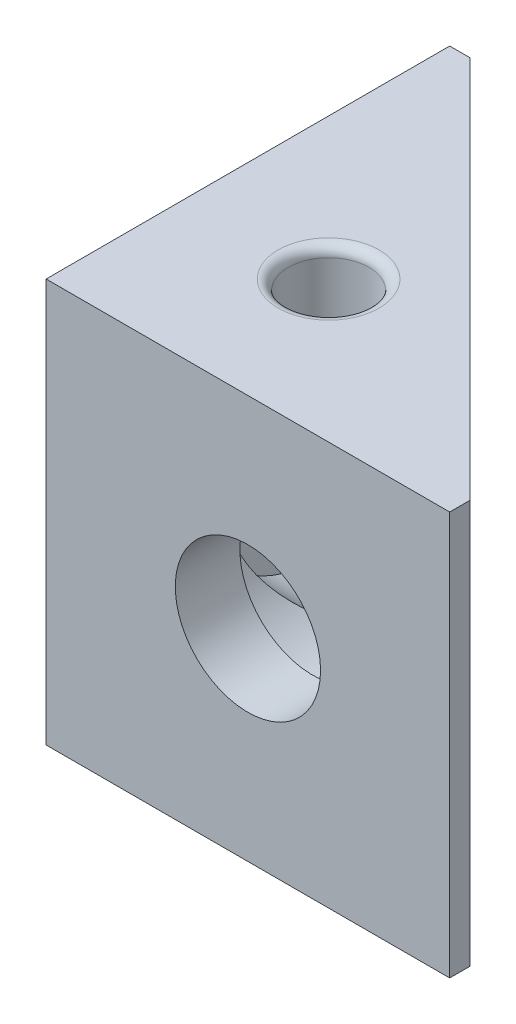
ISO-10303-21;
HEADER;
FILE_DESCRIPTION(('STEP AP214'),'2;1');
FILE_NAME('part.step','',(''),(''),'','','');
FILE_SCHEMA(('AUTOMOTIVE_DESIGN { 1 0 10303 214 1 1 1 1 }'));
ENDSEC;
DATA;
#1=APPLICATION_CONTEXT('core data for automotive mechanical design processes');
#2=APPLICATION_PROTOCOL_DEFINITION('international standard','automotive_design',2000,#1);
#3=PRODUCT_CONTEXT('',#1,'mechanical');
#4=PRODUCT('Part','Part','',(#3));
#5=PRODUCT_RELATED_PRODUCT_CATEGORY('part','',(#4));
#6=PRODUCT_DEFINITION_FORMATION('','',#4);
#7=PRODUCT_DEFINITION_CONTEXT('part definition',#1,'design');
#8=PRODUCT_DEFINITION('design','',#6,#7);
#9=PRODUCT_DEFINITION_SHAPE('','',#8);
#10=(LENGTH_UNIT() NAMED_UNIT(*) SI_UNIT(.MILLI.,.METRE.));
#11=(NAMED_UNIT(*) PLANE_ANGLE_UNIT() SI_UNIT($,.RADIAN.));
#12=(NAMED_UNIT(*) SI_UNIT($,.STERADIAN.) SOLID_ANGLE_UNIT());
#13=UNCERTAINTY_MEASURE_WITH_UNIT(LENGTH_MEASURE(1.E-05),#10,'distance_accuracy_value','');
#14=(GEOMETRIC_REPRESENTATION_CONTEXT(3) GLOBAL_UNCERTAINTY_ASSIGNED_CONTEXT((#13)) GLOBAL_UNIT_ASSIGNED_CONTEXT((#10,
#11,#12)) REPRESENTATION_CONTEXT('',''));
#15=CARTESIAN_POINT('',(0.,0.,0.));
#16=DIRECTION('',(0.,0.,1.));
#17=DIRECTION('',(1.,0.,0.));
#18=AXIS2_PLACEMENT_3D('',#15,#16,#17);
#19=CARTESIAN_POINT('',(10.,0.,-29.778174593052));
#20=DIRECTION('',(0.,0.,1.));
#21=DIRECTION('',(1.,0.,0.));
#22=AXIS2_PLACEMENT_3D('',#19,#20,#21);
#23=CYLINDRICAL_SURFACE('',#22,5.5);
#24=CARTESIAN_POINT('',(10.,0.,-3.2));
#25=DIRECTION('',(0.,0.,1.));
#26=DIRECTION('',(1.,0.,0.));
#27=AXIS2_PLACEMENT_3D('',#24,#25,#26);
#28=CIRCLE('',#27,5.5);
#29=CARTESIAN_POINT('',(15.5,0.,-3.2));
#30=VERTEX_POINT('',#29);
#31=EDGE_CURVE('E227',#30,#30,#28,.T.);
#32=ORIENTED_EDGE('',*,*,#31,.T.);
#33=EDGE_LOOP('',(#32));
#34=FACE_BOUND('',#33,.T.);
#35=CARTESIAN_POINT('',(10.,0.,-10.));
#36=DIRECTION('',(0.707106781186547,0.,0.707106781186547));
#37=DIRECTION('',(-0.707106781186547,0.,0.707106781186547));
#38=AXIS2_PLACEMENT_3D('',#35,#36,#37);
#39=ELLIPSE('',#38,7.77817459305202,5.5);
#40=CARTESIAN_POINT('',(10.,-5.5,-10.));
#41=VERTEX_POINT('',#40);
#42=CARTESIAN_POINT('',(10.,5.5,-10.));
#43=VERTEX_POINT('',#42);
#44=EDGE_CURVE('E54',#41,#43,#39,.F.);
#45=ORIENTED_EDGE('',*,*,#44,.T.);
#46=CARTESIAN_POINT('',(10.,0.,-10.));
#47=DIRECTION('',(-0.707106781186547,0.,0.707106781186547));
#48=DIRECTION('',(0.707106781186547,0.,0.707106781186547));
#49=AXIS2_PLACEMENT_3D('',#46,#47,#48);
#50=ELLIPSE('',#49,7.77817459305202,5.5);
#51=EDGE_CURVE('E151',#43,#41,#50,.F.);
#52=ORIENTED_EDGE('',*,*,#51,.T.);
#53=EDGE_LOOP('',(#45,#52));
#54=FACE_BOUND('',#53,.T.);
#55=ADVANCED_FACE('F40',(#34,#54),#23,.F.);
#56=CARTESIAN_POINT('',(20.,10.,0.));
#57=DIRECTION('',(0.,0.,-1.));
#58=DIRECTION('',(-1.,0.,0.));
#59=AXIS2_PLACEMENT_3D('',#56,#57,#58);
#60=PLANE('',#59);
#61=CARTESIAN_POINT('',(10.,0.,0.));
#62=DIRECTION('',(0.,0.,1.));
#63=DIRECTION('',(1.,0.,0.));
#64=AXIS2_PLACEMENT_3D('',#61,#62,#63);
#65=CIRCLE('',#64,3.6);
#66=CARTESIAN_POINT('',(13.6,0.,0.));
#67=VERTEX_POINT('',#66);
#68=EDGE_CURVE('E131',#67,#67,#65,.T.);
#69=ORIENTED_EDGE('',*,*,#68,.F.);
#70=EDGE_LOOP('',(#69));
#71=FACE_BOUND('',#70,.T.);
#72=DIRECTION('',(1.,0.,0.));
#73=VECTOR('',#72,1.);
#74=CARTESIAN_POINT('',(20.,-10.,0.));
#75=LINE('',#74,#73);
#76=CARTESIAN_POINT('',(0.,-10.,0.));
#77=VERTEX_POINT('',#76);
#78=CARTESIAN_POINT('',(20.,-10.,0.));
#79=VERTEX_POINT('',#78);
#80=EDGE_CURVE('E127',#77,#79,#75,.T.);
#81=ORIENTED_EDGE('',*,*,#80,.T.);
#82=DIRECTION('',(0.,-1.,0.));
#83=VECTOR('',#82,1.);
#84=CARTESIAN_POINT('',(20.,10.,0.));
#85=LINE('',#84,#83);
#86=CARTESIAN_POINT('',(20.,10.,0.));
#87=VERTEX_POINT('',#86);
#88=EDGE_CURVE('E141',#87,#79,#85,.T.);
#89=ORIENTED_EDGE('',*,*,#88,.F.);
#90=DIRECTION('',(1.,0.,0.));
#91=VECTOR('',#90,1.);
#92=CARTESIAN_POINT('',(20.,10.,0.));
#93=LINE('',#92,#91);
#94=CARTESIAN_POINT('',(0.,10.,0.));
#95=VERTEX_POINT('',#94);
#96=EDGE_CURVE('E137',#95,#87,#93,.T.);
#97=ORIENTED_EDGE('',*,*,#96,.F.);
#98=DIRECTION('',(0.,-1.,0.));
#99=VECTOR('',#98,1.);
#100=CARTESIAN_POINT('',(0.,10.,0.));
#101=LINE('',#100,#99);
#102=EDGE_CURVE('E123',#95,#77,#101,.T.);
#103=ORIENTED_EDGE('',*,*,#102,.T.);
#104=EDGE_LOOP('',(#81,#89,#97,#103));
#105=FACE_BOUND('',#104,.T.);
#106=ADVANCED_FACE('F169',(#71,#105),#60,.F.);
#107=CARTESIAN_POINT('',(20.,10.,0.));
#108=DIRECTION('',(-1.,0.,0.));
#109=DIRECTION('',(0.,0.,1.));
#110=AXIS2_PLACEMENT_3D('',#107,#108,#109);
#111=PLANE('',#110);
#112=DIRECTION('',(0.,0.,-1.));
#113=VECTOR('',#112,1.);
#114=CARTESIAN_POINT('',(20.,-10.,0.));
#115=LINE('',#114,#113);
#116=CARTESIAN_POINT('',(20.,-10.,-1.));
#117=VERTEX_POINT('',#116);
#118=EDGE_CURVE('E130',#79,#117,#115,.T.);
#119=ORIENTED_EDGE('',*,*,#118,.T.);
#120=DIRECTION('',(0.,-1.,0.));
#121=VECTOR('',#120,1.);
#122=CARTESIAN_POINT('',(20.,10.,-1.));
#123=LINE('',#122,#121);
#124=CARTESIAN_POINT('',(20.,10.,-1.));
#125=VERTEX_POINT('',#124);
#126=EDGE_CURVE('E118',#125,#117,#123,.T.);
#127=ORIENTED_EDGE('',*,*,#126,.F.);
#128=DIRECTION('',(0.,0.,-1.));
#129=VECTOR('',#128,1.);
#130=CARTESIAN_POINT('',(20.,10.,0.));
#131=LINE('',#130,#129);
#132=EDGE_CURVE('E96',#87,#125,#131,.T.);
#133=ORIENTED_EDGE('',*,*,#132,.F.);
#134=ORIENTED_EDGE('',*,*,#88,.T.);
#135=EDGE_LOOP('',(#119,#127,#133,#134));
#136=FACE_BOUND('',#135,.T.);
#137=ADVANCED_FACE('F178',(#136),#111,.F.);
#138=CARTESIAN_POINT('',(1.,10.,-20.));
#139=DIRECTION('',(-0.707106781186548,0.,0.707106781186548));
#140=DIRECTION('',(0.707106781186548,0.,0.707106781186548));
#141=AXIS2_PLACEMENT_3D('',#138,#139,#140);
#142=PLANE('',#141);
#143=CARTESIAN_POINT('',(10.,0.,-11.));
#144=DIRECTION('',(-0.707106781186548,0.,0.707106781186548));
#145=DIRECTION('',(0.707106781186548,0.,0.707106781186548));
#146=AXIS2_PLACEMENT_3D('',#143,#144,#145);
#147=ELLIPSE('',#146,7.77817459305202,5.5);
#148=CARTESIAN_POINT('',(10.5000000000004,-5.47722557505166,-10.4999999999996));
#149=VERTEX_POINT('',#148);
#150=CARTESIAN_POINT('',(10.5000000000004,5.47722557505166,-10.4999999999996));
#151=VERTEX_POINT('',#150);
#152=EDGE_CURVE('E201',#149,#151,#147,.F.);
#153=ORIENTED_EDGE('',*,*,#152,.F.);
#154=CARTESIAN_POINT('',(11.,0.,-10.));
#155=DIRECTION('',(-0.707106781186548,0.,0.707106781186548));
#156=DIRECTION('',(-0.707106781186548,0.,-0.707106781186548));
#157=AXIS2_PLACEMENT_3D('',#154,#155,#156);
#158=ELLIPSE('',#157,7.77817459305202,5.5);
#159=EDGE_CURVE('E209',#151,#149,#158,.F.);
#160=ORIENTED_EDGE('',*,*,#159,.F.);
#161=EDGE_LOOP('',(#153,#160));
#162=FACE_BOUND('',#161,.T.);
#163=DIRECTION('',(-0.707106781186548,0.,-0.707106781186548));
#164=VECTOR('',#163,1.);
#165=CARTESIAN_POINT('',(1.,-10.,-20.));
#166=LINE('',#165,#164);
#167=CARTESIAN_POINT('',(1.,-10.,-20.));
#168=VERTEX_POINT('',#167);
#169=EDGE_CURVE('E115',#117,#168,#166,.T.);
#170=ORIENTED_EDGE('',*,*,#169,.T.);
#171=DIRECTION('',(0.,-1.,0.));
#172=VECTOR('',#171,1.);
#173=CARTESIAN_POINT('',(1.,10.,-20.));
#174=LINE('',#173,#172);
#175=CARTESIAN_POINT('',(1.,10.,-20.));
#176=VERTEX_POINT('',#175);
#177=EDGE_CURVE('E112',#176,#168,#174,.T.);
#178=ORIENTED_EDGE('',*,*,#177,.F.);
#179=DIRECTION('',(-0.707106781186548,0.,-0.707106781186548));
#180=VECTOR('',#179,1.);
#181=CARTESIAN_POINT('',(1.,10.,-20.));
#182=LINE('',#181,#180);
#183=EDGE_CURVE('E102',#125,#176,#182,.T.);
#184=ORIENTED_EDGE('',*,*,#183,.F.);
#185=ORIENTED_EDGE('',*,*,#126,.T.);
#186=EDGE_LOOP('',(#170,#178,#184,#185));
#187=FACE_BOUND('',#186,.T.);
#188=ADVANCED_FACE('F113',(#162,#187),#142,.F.);
#189=CARTESIAN_POINT('',(0.,10.,-20.));
#190=DIRECTION('',(0.,0.,1.));
#191=DIRECTION('',(1.,0.,0.));
#192=AXIS2_PLACEMENT_3D('',#189,#190,#191);
#193=PLANE('',#192);
#194=DIRECTION('',(-1.,0.,0.));
#195=VECTOR('',#194,1.);
#196=CARTESIAN_POINT('',(0.,-10.,-20.));
#197=LINE('',#196,#195);
#198=CARTESIAN_POINT('',(0.,-10.,-20.));
#199=VERTEX_POINT('',#198);
#200=EDGE_CURVE('E134',#168,#199,#197,.T.);
#201=ORIENTED_EDGE('',*,*,#200,.T.);
#202=DIRECTION('',(0.,-1.,0.));
#203=VECTOR('',#202,1.);
#204=CARTESIAN_POINT('',(0.,10.,-20.));
#205=LINE('',#204,#203);
#206=CARTESIAN_POINT('',(0.,10.,-20.));
#207=VERTEX_POINT('',#206);
#208=EDGE_CURVE('E119',#207,#199,#205,.T.);
#209=ORIENTED_EDGE('',*,*,#208,.F.);
#210=DIRECTION('',(-1.,0.,0.));
#211=VECTOR('',#210,1.);
#212=CARTESIAN_POINT('',(0.,10.,-20.));
#213=LINE('',#212,#211);
#214=EDGE_CURVE('E106',#176,#207,#213,.T.);
#215=ORIENTED_EDGE('',*,*,#214,.F.);
#216=ORIENTED_EDGE('',*,*,#177,.T.);
#217=EDGE_LOOP('',(#201,#209,#215,#216));
#218=FACE_BOUND('',#217,.T.);
#219=ADVANCED_FACE('F121',(#218),#193,.F.);
#220=CARTESIAN_POINT('',(0.,10.,0.));
#221=DIRECTION('',(1.,0.,0.));
#222=DIRECTION('',(0.,0.,-1.));
#223=AXIS2_PLACEMENT_3D('',#220,#221,#222);
#224=PLANE('',#223);
#225=CARTESIAN_POINT('',(0.,0.,-10.));
#226=DIRECTION('',(-1.,0.,0.));
#227=DIRECTION('',(0.,0.,1.));
#228=AXIS2_PLACEMENT_3D('',#225,#226,#227);
#229=CIRCLE('',#228,3.6);
#230=CARTESIAN_POINT('',(0.,0.,-6.4));
#231=VERTEX_POINT('',#230);
#232=EDGE_CURVE('E212',#231,#231,#229,.T.);
#233=ORIENTED_EDGE('',*,*,#232,.F.);
#234=EDGE_LOOP('',(#233));
#235=FACE_BOUND('',#234,.T.);
#236=DIRECTION('',(0.,0.,1.));
#237=VECTOR('',#236,1.);
#238=CARTESIAN_POINT('',(0.,-10.,0.));
#239=LINE('',#238,#237);
#240=EDGE_CURVE('E87',#199,#77,#239,.T.);
#241=ORIENTED_EDGE('',*,*,#240,.T.);
#242=ORIENTED_EDGE('',*,*,#102,.F.);
#243=DIRECTION('',(0.,0.,1.));
#244=VECTOR('',#243,1.);
#245=CARTESIAN_POINT('',(0.,10.,0.));
#246=LINE('',#245,#244);
#247=EDGE_CURVE('E63',#207,#95,#246,.T.);
#248=ORIENTED_EDGE('',*,*,#247,.F.);
#249=ORIENTED_EDGE('',*,*,#208,.T.);
#250=EDGE_LOOP('',(#241,#242,#248,#249));
#251=FACE_BOUND('',#250,.T.);
#252=ADVANCED_FACE('F238',(#235,#251),#224,.F.);
#253=CARTESIAN_POINT('',(0.,10.,0.));
#254=DIRECTION('',(0.,-1.,0.));
#255=DIRECTION('',(0.,0.,-1.));
#256=AXIS2_PLACEMENT_3D('',#253,#254,#255);
#257=PLANE('',#256);
#258=CARTESIAN_POINT('',(7.,10.,-7.));
#259=DIRECTION('',(0.,-1.,0.));
#260=DIRECTION('',(0.,0.,-1.));
#261=AXIS2_PLACEMENT_3D('',#258,#259,#260);
#262=CIRCLE('',#261,2.5);
#263=CARTESIAN_POINT('',(7.,10.,-9.5));
#264=VERTEX_POINT('',#263);
#265=EDGE_CURVE('E11',#264,#264,#262,.T.);
#266=ORIENTED_EDGE('',*,*,#265,.T.);
#267=EDGE_LOOP('',(#266));
#268=FACE_BOUND('',#267,.T.);
#269=ORIENTED_EDGE('',*,*,#96,.T.);
#270=ORIENTED_EDGE('',*,*,#132,.T.);
#271=ORIENTED_EDGE('',*,*,#183,.T.);
#272=ORIENTED_EDGE('',*,*,#214,.T.);
#273=ORIENTED_EDGE('',*,*,#247,.T.);
#274=EDGE_LOOP('',(#269,#270,#271,#272,#273));
#275=FACE_BOUND('',#274,.T.);
#276=ADVANCED_FACE('F104',(#268,#275),#257,.F.);
#277=CARTESIAN_POINT('',(0.,-10.,0.));
#278=DIRECTION('',(0.,-1.,0.));
#279=DIRECTION('',(0.,0.,-1.));
#280=AXIS2_PLACEMENT_3D('',#277,#278,#279);
#281=PLANE('',#280);
#282=ORIENTED_EDGE('',*,*,#80,.F.);
#283=ORIENTED_EDGE('',*,*,#240,.F.);
#284=ORIENTED_EDGE('',*,*,#200,.F.);
#285=ORIENTED_EDGE('',*,*,#169,.F.);
#286=ORIENTED_EDGE('',*,*,#118,.F.);
#287=EDGE_LOOP('',(#282,#283,#284,#285,#286));
#288=FACE_BOUND('',#287,.T.);
#289=ADVANCED_FACE('F194',(#288),#281,.T.);
#290=CARTESIAN_POINT('',(10.,0.,-23.2911688245431));
#291=DIRECTION('',(0.,0.,1.));
#292=DIRECTION('',(1.,0.,0.));
#293=AXIS2_PLACEMENT_3D('',#290,#291,#292);
#294=CYLINDRICAL_SURFACE('',#293,3.6);
#295=CARTESIAN_POINT('',(10.,0.,-3.2));
#296=DIRECTION('',(0.,0.,1.));
#297=DIRECTION('',(1.,0.,0.));
#298=AXIS2_PLACEMENT_3D('',#295,#296,#297);
#299=CIRCLE('',#298,3.6);
#300=CARTESIAN_POINT('',(13.6,0.,-3.2));
#301=VERTEX_POINT('',#300);
#302=EDGE_CURVE('E216',#301,#301,#299,.T.);
#303=ORIENTED_EDGE('',*,*,#302,.F.);
#304=EDGE_LOOP('',(#303));
#305=FACE_BOUND('',#304,.T.);
#306=ORIENTED_EDGE('',*,*,#68,.T.);
#307=EDGE_LOOP('',(#306));
#308=FACE_BOUND('',#307,.T.);
#309=ADVANCED_FACE('F185',(#305,#308),#294,.F.);
#310=CARTESIAN_POINT('',(10.,0.,-10.));
#311=DIRECTION('',(0.707106781186547,0.,0.707106781186547));
#312=DIRECTION('',(-0.707106781186547,0.,0.707106781186547));
#313=AXIS2_PLACEMENT_3D('',#310,#311,#312);
#314=ELLIPSE('',#313,7.77817459305202,5.5);
#315=EDGE_CURVE('E144',#151,#43,#314,.T.);
#316=ORIENTED_EDGE('',*,*,#315,.T.);
#317=CARTESIAN_POINT('',(10.,0.,-10.));
#318=DIRECTION('',(-0.707106781186547,0.,0.707106781186547));
#319=DIRECTION('',(0.707106781186547,0.,0.707106781186547));
#320=AXIS2_PLACEMENT_3D('',#317,#318,#319);
#321=ELLIPSE('',#320,7.77817459305202,5.5);
#322=EDGE_CURVE('E148',#43,#41,#321,.T.);
#323=ORIENTED_EDGE('',*,*,#322,.T.);
#324=EDGE_CURVE('E147',#41,#149,#314,.T.);
#325=ORIENTED_EDGE('',*,*,#324,.T.);
#326=ORIENTED_EDGE('',*,*,#152,.T.);
#327=EDGE_LOOP('',(#316,#323,#325,#326));
#328=FACE_BOUND('',#327,.T.);
#329=ADVANCED_FACE('F172',(#328),#23,.F.);
#330=CARTESIAN_POINT('',(10.,0.,-3.2));
#331=DIRECTION('',(0.,0.,1.));
#332=DIRECTION('',(1.,0.,0.));
#333=AXIS2_PLACEMENT_3D('',#330,#331,#332);
#334=PLANE('',#333);
#335=ORIENTED_EDGE('',*,*,#302,.T.);
#336=EDGE_LOOP('',(#335));
#337=FACE_BOUND('',#336,.T.);
#338=ORIENTED_EDGE('',*,*,#31,.F.);
#339=EDGE_LOOP('',(#338));
#340=FACE_BOUND('',#339,.T.);
#341=ADVANCED_FACE('F184',(#337,#340),#334,.F.);
#342=CARTESIAN_POINT('',(23.2911688245431,0.,-10.));
#343=DIRECTION('',(-1.,0.,0.));
#344=DIRECTION('',(0.,0.,1.));
#345=AXIS2_PLACEMENT_3D('',#342,#343,#344);
#346=CYLINDRICAL_SURFACE('',#345,3.6);
#347=CARTESIAN_POINT('',(3.2,0.,-10.));
#348=DIRECTION('',(-1.,0.,0.));
#349=DIRECTION('',(0.,0.,1.));
#350=AXIS2_PLACEMENT_3D('',#347,#348,#349);
#351=CIRCLE('',#350,3.6);
#352=CARTESIAN_POINT('',(3.2,0.,-6.4));
#353=VERTEX_POINT('',#352);
#354=EDGE_CURVE('E219',#353,#353,#351,.T.);
#355=ORIENTED_EDGE('',*,*,#354,.F.);
#356=EDGE_LOOP('',(#355));
#357=FACE_BOUND('',#356,.T.);
#358=ORIENTED_EDGE('',*,*,#232,.T.);
#359=EDGE_LOOP('',(#358));
#360=FACE_BOUND('',#359,.T.);
#361=ADVANCED_FACE('F191',(#357,#360),#346,.F.);
#362=CARTESIAN_POINT('',(3.2,0.,-10.));
#363=DIRECTION('',(-1.,0.,0.));
#364=DIRECTION('',(0.,0.,1.));
#365=AXIS2_PLACEMENT_3D('',#362,#363,#364);
#366=PLANE('',#365);
#367=ORIENTED_EDGE('',*,*,#354,.T.);
#368=EDGE_LOOP('',(#367));
#369=FACE_BOUND('',#368,.T.);
#370=CARTESIAN_POINT('',(3.2,0.,-10.));
#371=DIRECTION('',(-1.,0.,0.));
#372=DIRECTION('',(0.,0.,1.));
#373=AXIS2_PLACEMENT_3D('',#370,#371,#372);
#374=CIRCLE('',#373,5.5);
#375=CARTESIAN_POINT('',(3.2,0.,-4.5));
#376=VERTEX_POINT('',#375);
#377=EDGE_CURVE('E213',#376,#376,#374,.T.);
#378=ORIENTED_EDGE('',*,*,#377,.F.);
#379=EDGE_LOOP('',(#378));
#380=FACE_BOUND('',#379,.T.);
#381=ADVANCED_FACE('F295',(#369,#380),#366,.F.);
#382=CARTESIAN_POINT('',(29.778174593052,0.,-10.));
#383=DIRECTION('',(-1.,0.,0.));
#384=DIRECTION('',(0.,0.,1.));
#385=AXIS2_PLACEMENT_3D('',#382,#383,#384);
#386=CYLINDRICAL_SURFACE('',#385,5.5);
#387=ORIENTED_EDGE('',*,*,#377,.T.);
#388=EDGE_LOOP('',(#387));
#389=FACE_BOUND('',#388,.T.);
#390=ORIENTED_EDGE('',*,*,#44,.F.);
#391=ORIENTED_EDGE('',*,*,#322,.F.);
#392=EDGE_LOOP('',(#390,#391));
#393=FACE_BOUND('',#392,.T.);
#394=ADVANCED_FACE('F309',(#389,#393),#386,.F.);
#395=ORIENTED_EDGE('',*,*,#315,.F.);
#396=ORIENTED_EDGE('',*,*,#159,.T.);
#397=ORIENTED_EDGE('',*,*,#324,.F.);
#398=ORIENTED_EDGE('',*,*,#51,.F.);
#399=EDGE_LOOP('',(#395,#396,#397,#398));
#400=FACE_BOUND('',#399,.T.);
#401=ADVANCED_FACE('F206',(#400),#386,.F.);
#402=CARTESIAN_POINT('',(7.,5.5,-7.));
#403=DIRECTION('',(0.,1.,0.));
#404=DIRECTION('',(0.,0.,1.));
#405=AXIS2_PLACEMENT_3D('',#402,#403,#404);
#406=CYLINDRICAL_SURFACE('',#405,2.);
#407=CARTESIAN_POINT('',(7.,9.5,-7.));
#408=DIRECTION('',(0.,-1.,0.));
#409=DIRECTION('',(0.,0.,-1.));
#410=AXIS2_PLACEMENT_3D('',#407,#408,#409);
#411=CIRCLE('',#410,2.);
#412=CARTESIAN_POINT('',(7.,9.5,-9.));
#413=VERTEX_POINT('',#412);
#414=EDGE_CURVE('E48',#413,#413,#411,.F.);
#415=ORIENTED_EDGE('',*,*,#414,.T.);
#416=EDGE_LOOP('',(#415));
#417=FACE_BOUND('',#416,.T.);
#418=CARTESIAN_POINT('',(7.,5.5,-7.));
#419=DIRECTION('',(0.,1.,0.));
#420=DIRECTION('',(0.,0.,1.));
#421=AXIS2_PLACEMENT_3D('',#418,#419,#420);
#422=CIRCLE('',#421,2.);
#423=CARTESIAN_POINT('',(7.,5.5,-5.));
#424=VERTEX_POINT('',#423);
#425=EDGE_CURVE('E223',#424,#424,#422,.T.);
#426=ORIENTED_EDGE('',*,*,#425,.F.);
#427=EDGE_LOOP('',(#426));
#428=FACE_BOUND('',#427,.T.);
#429=ADVANCED_FACE('F155',(#417,#428),#406,.F.);
#430=CARTESIAN_POINT('',(7.,5.5,-7.));
#431=DIRECTION('',(0.,1.,0.));
#432=DIRECTION('',(0.,0.,1.));
#433=AXIS2_PLACEMENT_3D('',#430,#431,#432);
#434=PLANE('',#433);
#435=ORIENTED_EDGE('',*,*,#425,.T.);
#436=EDGE_LOOP('',(#435));
#437=FACE_BOUND('',#436,.T.);
#438=ADVANCED_FACE('F159',(#437),#434,.T.);
#439=CARTESIAN_POINT('',(7.,9.5,-7.));
#440=DIRECTION('',(0.,-1.,0.));
#441=DIRECTION('',(0.,0.,-1.));
#442=AXIS2_PLACEMENT_3D('',#439,#440,#441);
#443=TOROIDAL_SURFACE('',#442,2.5,0.5);
#444=ORIENTED_EDGE('',*,*,#265,.F.);
#445=EDGE_LOOP('',(#444));
#446=FACE_BOUND('',#445,.T.);
#447=ORIENTED_EDGE('',*,*,#414,.F.);
#448=EDGE_LOOP('',(#447));
#449=FACE_BOUND('',#448,.T.);
#450=ADVANCED_FACE('F42',(#446,#449),#443,.T.);
#451=CLOSED_SHELL('',(#55,#106,#137,#188,#219,#252,#276,#289,#309,#329,#341,#361,#381,#394,#401,
#429,#438,#450));
#452=MANIFOLD_SOLID_BREP('B2',#451);
#453=ADVANCED_BREP_SHAPE_REPRESENTATION('',(#18,#452),#14);
#454=SHAPE_DEFINITION_REPRESENTATION(#9,#453);
ENDSEC;
END-ISO-10303-21;
